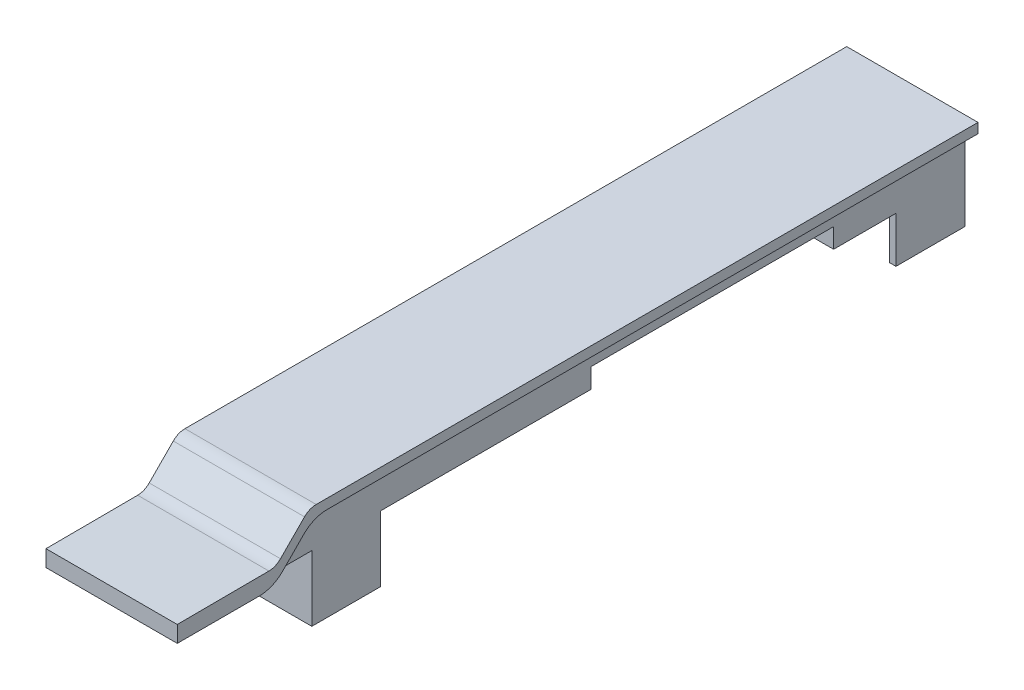
ISO-10303-21;
HEADER;
FILE_DESCRIPTION(('STEP AP214'),'2;1');
FILE_NAME('part.step','',(''),(''),'','','');
FILE_SCHEMA(('AUTOMOTIVE_DESIGN { 1 0 10303 214 1 1 1 1 }'));
ENDSEC;
DATA;
#1=APPLICATION_CONTEXT('core data for automotive mechanical design processes');
#2=APPLICATION_PROTOCOL_DEFINITION('international standard','automotive_design',2000,#1);
#3=PRODUCT_CONTEXT('',#1,'mechanical');
#4=PRODUCT('Part','Part','',(#3));
#5=PRODUCT_RELATED_PRODUCT_CATEGORY('part','',(#4));
#6=PRODUCT_DEFINITION_FORMATION('','',#4);
#7=PRODUCT_DEFINITION_CONTEXT('part definition',#1,'design');
#8=PRODUCT_DEFINITION('design','',#6,#7);
#9=PRODUCT_DEFINITION_SHAPE('','',#8);
#10=(LENGTH_UNIT() NAMED_UNIT(*) SI_UNIT(.MILLI.,.METRE.));
#11=(NAMED_UNIT(*) PLANE_ANGLE_UNIT() SI_UNIT($,.RADIAN.));
#12=(NAMED_UNIT(*) SI_UNIT($,.STERADIAN.) SOLID_ANGLE_UNIT());
#13=UNCERTAINTY_MEASURE_WITH_UNIT(LENGTH_MEASURE(1.E-05),#10,'distance_accuracy_value','');
#14=(GEOMETRIC_REPRESENTATION_CONTEXT(3) GLOBAL_UNCERTAINTY_ASSIGNED_CONTEXT((#13)) GLOBAL_UNIT_ASSIGNED_CONTEXT((#10,
#11,#12)) REPRESENTATION_CONTEXT('',''));
#15=CARTESIAN_POINT('',(0.,0.,0.));
#16=DIRECTION('',(0.,0.,1.));
#17=DIRECTION('',(1.,0.,0.));
#18=AXIS2_PLACEMENT_3D('',#15,#16,#17);
#19=CARTESIAN_POINT('',(40.,0.,0.));
#20=DIRECTION('',(0.,1.,0.));
#21=DIRECTION('',(0.,0.,1.));
#22=AXIS2_PLACEMENT_3D('',#19,#20,#21);
#23=PLANE('',#22);
#24=DIRECTION('',(-1.,0.,0.));
#25=VECTOR('',#24,1.);
#26=CARTESIAN_POINT('',(36.,0.,85.));
#27=LINE('',#26,#25);
#28=CARTESIAN_POINT('',(36.,0.,85.));
#29=VERTEX_POINT('',#28);
#30=CARTESIAN_POINT('',(4.,0.,85.));
#31=VERTEX_POINT('',#30);
#32=EDGE_CURVE('E357',#29,#31,#27,.T.);
#33=ORIENTED_EDGE('',*,*,#32,.F.);
#34=DIRECTION('',(0.,0.,-1.));
#35=VECTOR('',#34,1.);
#36=CARTESIAN_POINT('',(36.,0.,100.876178748993));
#37=LINE('',#36,#35);
#38=CARTESIAN_POINT('',(36.,0.,105.047297751826));
#39=VERTEX_POINT('',#38);
#40=EDGE_CURVE('E426',#39,#29,#37,.T.);
#41=ORIENTED_EDGE('',*,*,#40,.F.);
#42=DIRECTION('',(1.,0.,0.));
#43=VECTOR('',#42,1.);
#44=CARTESIAN_POINT('',(40.,0.,105.047297751826));
#45=LINE('',#44,#43);
#46=CARTESIAN_POINT('',(40.,0.,105.047297751826));
#47=VERTEX_POINT('',#46);
#48=EDGE_CURVE('E505',#39,#47,#45,.T.);
#49=ORIENTED_EDGE('',*,*,#48,.T.);
#50=DIRECTION('',(0.,0.,-1.));
#51=VECTOR('',#50,1.);
#52=CARTESIAN_POINT('',(40.,0.,0.));
#53=LINE('',#52,#51);
#54=CARTESIAN_POINT('',(40.,0.,130.));
#55=VERTEX_POINT('',#54);
#56=EDGE_CURVE('E456',#55,#47,#53,.T.);
#57=ORIENTED_EDGE('',*,*,#56,.F.);
#58=DIRECTION('',(-1.,0.,0.));
#59=VECTOR('',#58,1.);
#60=CARTESIAN_POINT('',(40.,0.,130.));
#61=LINE('',#60,#59);
#62=CARTESIAN_POINT('',(0.,0.,130.));
#63=VERTEX_POINT('',#62);
#64=EDGE_CURVE('E475',#55,#63,#61,.T.);
#65=ORIENTED_EDGE('',*,*,#64,.T.);
#66=DIRECTION('',(0.,0.,-1.));
#67=VECTOR('',#66,1.);
#68=CARTESIAN_POINT('',(0.,0.,0.));
#69=LINE('',#68,#67);
#70=CARTESIAN_POINT('',(0.,0.,105.047297751826));
#71=VERTEX_POINT('',#70);
#72=EDGE_CURVE('E446',#63,#71,#69,.T.);
#73=ORIENTED_EDGE('',*,*,#72,.T.);
#74=DIRECTION('',(-1.,0.,0.));
#75=VECTOR('',#74,1.);
#76=CARTESIAN_POINT('',(4.,0.,105.047297751826));
#77=LINE('',#76,#75);
#78=CARTESIAN_POINT('',(4.,0.,105.047297751826));
#79=VERTEX_POINT('',#78);
#80=EDGE_CURVE('E508',#71,#79,#77,.F.);
#81=ORIENTED_EDGE('',*,*,#80,.T.);
#82=DIRECTION('',(0.,0.,-1.));
#83=VECTOR('',#82,1.);
#84=CARTESIAN_POINT('',(4.,0.,100.876178748993));
#85=LINE('',#84,#83);
#86=EDGE_CURVE('E391',#79,#31,#85,.T.);
#87=ORIENTED_EDGE('',*,*,#86,.T.);
#88=EDGE_LOOP('',(#33,#41,#49,#57,#65,#73,#81,#87));
#89=FACE_BOUND('',#88,.T.);
#90=ADVANCED_FACE('F39',(#89),#23,.F.);
#91=DIRECTION('',(1.,0.,0.));
#92=VECTOR('',#91,1.);
#93=CARTESIAN_POINT('',(36.,0.,64.));
#94=LINE('',#93,#92);
#95=CARTESIAN_POINT('',(34.,0.,64.));
#96=VERTEX_POINT('',#95);
#97=CARTESIAN_POINT('',(36.,0.,64.));
#98=VERTEX_POINT('',#97);
#99=EDGE_CURVE('E354',#96,#98,#94,.T.);
#100=ORIENTED_EDGE('',*,*,#99,.F.);
#101=DIRECTION('',(0.,0.,-1.));
#102=VECTOR('',#101,1.);
#103=CARTESIAN_POINT('',(34.,0.,64.));
#104=LINE('',#103,#102);
#105=CARTESIAN_POINT('',(34.,0.,83.));
#106=VERTEX_POINT('',#105);
#107=EDGE_CURVE('E351',#106,#96,#104,.T.);
#108=ORIENTED_EDGE('',*,*,#107,.F.);
#109=DIRECTION('',(1.,0.,0.));
#110=VECTOR('',#109,1.);
#111=CARTESIAN_POINT('',(6.,0.,83.));
#112=LINE('',#111,#110);
#113=CARTESIAN_POINT('',(6.,0.,83.));
#114=VERTEX_POINT('',#113);
#115=EDGE_CURVE('E348',#114,#106,#112,.T.);
#116=ORIENTED_EDGE('',*,*,#115,.F.);
#117=DIRECTION('',(0.,0.,1.));
#118=VECTOR('',#117,1.);
#119=CARTESIAN_POINT('',(6.,0.,64.));
#120=LINE('',#119,#118);
#121=CARTESIAN_POINT('',(6.,0.,64.));
#122=VERTEX_POINT('',#121);
#123=EDGE_CURVE('E316',#122,#114,#120,.T.);
#124=ORIENTED_EDGE('',*,*,#123,.F.);
#125=DIRECTION('',(1.,0.,0.));
#126=VECTOR('',#125,1.);
#127=CARTESIAN_POINT('',(4.,0.,64.));
#128=LINE('',#127,#126);
#129=CARTESIAN_POINT('',(4.,0.,64.));
#130=VERTEX_POINT('',#129);
#131=EDGE_CURVE('E331',#130,#122,#128,.T.);
#132=ORIENTED_EDGE('',*,*,#131,.F.);
#133=CARTESIAN_POINT('',(4.,0.,0.));
#134=VERTEX_POINT('',#133);
#135=EDGE_CURVE('E394',#130,#134,#85,.T.);
#136=ORIENTED_EDGE('',*,*,#135,.T.);
#137=DIRECTION('',(-1.,0.,0.));
#138=VECTOR('',#137,1.);
#139=CARTESIAN_POINT('',(40.,0.,0.));
#140=LINE('',#139,#138);
#141=CARTESIAN_POINT('',(36.,0.,0.));
#142=VERTEX_POINT('',#141);
#143=EDGE_CURVE('E459',#142,#134,#140,.T.);
#144=ORIENTED_EDGE('',*,*,#143,.F.);
#145=EDGE_CURVE('E430',#98,#142,#37,.T.);
#146=ORIENTED_EDGE('',*,*,#145,.F.);
#147=EDGE_LOOP('',(#100,#108,#116,#124,#132,#136,#144,#146));
#148=FACE_BOUND('',#147,.T.);
#149=ADVANCED_FACE('F614',(#148),#23,.F.);
#150=CARTESIAN_POINT('',(40.,0.,0.));
#151=DIRECTION('',(0.,0.,1.));
#152=DIRECTION('',(1.,0.,0.));
#153=AXIS2_PLACEMENT_3D('',#150,#151,#152);
#154=PLANE('',#153);
#155=DIRECTION('',(0.,-1.,0.));
#156=VECTOR('',#155,1.);
#157=CARTESIAN_POINT('',(4.,0.,0.));
#158=LINE('',#157,#156);
#159=CARTESIAN_POINT('',(4.,6.,0.));
#160=VERTEX_POINT('',#159);
#161=EDGE_CURVE('E411',#160,#134,#158,.T.);
#162=ORIENTED_EDGE('',*,*,#161,.F.);
#163=DIRECTION('',(-1.,0.,0.));
#164=VECTOR('',#163,1.);
#165=CARTESIAN_POINT('',(40.,6.,0.));
#166=LINE('',#165,#164);
#167=CARTESIAN_POINT('',(36.,6.,0.));
#168=VERTEX_POINT('',#167);
#169=EDGE_CURVE('E490',#168,#160,#166,.T.);
#170=ORIENTED_EDGE('',*,*,#169,.F.);
#171=DIRECTION('',(0.,1.,0.));
#172=VECTOR('',#171,1.);
#173=CARTESIAN_POINT('',(36.,0.,0.));
#174=LINE('',#173,#172);
#175=EDGE_CURVE('E440',#142,#168,#174,.T.);
#176=ORIENTED_EDGE('',*,*,#175,.F.);
#177=ORIENTED_EDGE('',*,*,#143,.T.);
#178=EDGE_LOOP('',(#162,#170,#176,#177));
#179=FACE_BOUND('',#178,.T.);
#180=ADVANCED_FACE('F620',(#179),#154,.F.);
#181=CARTESIAN_POINT('',(40.,6.,0.));
#182=DIRECTION('',(0.,1.,0.));
#183=DIRECTION('',(0.,0.,1.));
#184=AXIS2_PLACEMENT_3D('',#181,#182,#183);
#185=PLANE('',#184);
#186=DIRECTION('',(0.,0.,1.));
#187=VECTOR('',#186,1.);
#188=CARTESIAN_POINT('',(4.,6.,0.));
#189=LINE('',#188,#187);
#190=CARTESIAN_POINT('',(4.,6.,-74.));
#191=VERTEX_POINT('',#190);
#192=EDGE_CURVE('E409',#191,#160,#189,.T.);
#193=ORIENTED_EDGE('',*,*,#192,.F.);
#194=DIRECTION('',(-1.,0.,0.));
#195=VECTOR('',#194,1.);
#196=CARTESIAN_POINT('',(40.,6.,-74.));
#197=LINE('',#196,#195);
#198=CARTESIAN_POINT('',(36.,6.,-74.));
#199=VERTEX_POINT('',#198);
#200=EDGE_CURVE('E487',#199,#191,#197,.T.);
#201=ORIENTED_EDGE('',*,*,#200,.F.);
#202=DIRECTION('',(0.,0.,-1.));
#203=VECTOR('',#202,1.);
#204=CARTESIAN_POINT('',(36.,6.,0.));
#205=LINE('',#204,#203);
#206=EDGE_CURVE('E438',#168,#199,#205,.T.);
#207=ORIENTED_EDGE('',*,*,#206,.F.);
#208=ORIENTED_EDGE('',*,*,#169,.T.);
#209=EDGE_LOOP('',(#193,#201,#207,#208));
#210=FACE_BOUND('',#209,.T.);
#211=ADVANCED_FACE('F921',(#210),#185,.F.);
#212=CARTESIAN_POINT('',(40.,6.,-74.));
#213=DIRECTION('',(0.,0.,-1.));
#214=DIRECTION('',(-1.,0.,0.));
#215=AXIS2_PLACEMENT_3D('',#212,#213,#214);
#216=PLANE('',#215);
#217=DIRECTION('',(0.,1.,0.));
#218=VECTOR('',#217,1.);
#219=CARTESIAN_POINT('',(4.,6.,-74.));
#220=LINE('',#219,#218);
#221=CARTESIAN_POINT('',(4.,0.,-74.));
#222=VERTEX_POINT('',#221);
#223=EDGE_CURVE('E407',#222,#191,#220,.T.);
#224=ORIENTED_EDGE('',*,*,#223,.F.);
#225=DIRECTION('',(-1.,0.,0.));
#226=VECTOR('',#225,1.);
#227=CARTESIAN_POINT('',(40.,0.,-74.));
#228=LINE('',#227,#226);
#229=CARTESIAN_POINT('',(36.,0.,-74.));
#230=VERTEX_POINT('',#229);
#231=EDGE_CURVE('E484',#230,#222,#228,.T.);
#232=ORIENTED_EDGE('',*,*,#231,.F.);
#233=DIRECTION('',(0.,-1.,0.));
#234=VECTOR('',#233,1.);
#235=CARTESIAN_POINT('',(36.,6.,-74.));
#236=LINE('',#235,#234);
#237=EDGE_CURVE('E436',#199,#230,#236,.T.);
#238=ORIENTED_EDGE('',*,*,#237,.F.);
#239=ORIENTED_EDGE('',*,*,#200,.T.);
#240=EDGE_LOOP('',(#224,#232,#238,#239));
#241=FACE_BOUND('',#240,.T.);
#242=ADVANCED_FACE('F929',(#241),#216,.F.);
#243=CARTESIAN_POINT('',(40.,0.,-74.));
#244=DIRECTION('',(0.,1.,0.));
#245=DIRECTION('',(0.,0.,1.));
#246=AXIS2_PLACEMENT_3D('',#243,#244,#245);
#247=PLANE('',#246);
#248=CARTESIAN_POINT('',(4.,0.,-93.));
#249=VERTEX_POINT('',#248);
#250=EDGE_CURVE('E389',#222,#249,#85,.T.);
#251=ORIENTED_EDGE('',*,*,#250,.T.);
#252=DIRECTION('',(1.,0.,0.));
#253=VECTOR('',#252,1.);
#254=CARTESIAN_POINT('',(4.,0.,-93.));
#255=LINE('',#254,#253);
#256=CARTESIAN_POINT('',(5.99999999999999,0.,-93.));
#257=VERTEX_POINT('',#256);
#258=EDGE_CURVE('E310',#249,#257,#255,.T.);
#259=ORIENTED_EDGE('',*,*,#258,.T.);
#260=DIRECTION('',(0.,0.,-1.));
#261=VECTOR('',#260,1.);
#262=CARTESIAN_POINT('',(6.,0.,-93.));
#263=LINE('',#262,#261);
#264=CARTESIAN_POINT('',(5.99999999999999,0.,-112.));
#265=VERTEX_POINT('',#264);
#266=EDGE_CURVE('E275',#257,#265,#263,.T.);
#267=ORIENTED_EDGE('',*,*,#266,.T.);
#268=DIRECTION('',(-1.,0.,0.));
#269=VECTOR('',#268,1.);
#270=CARTESIAN_POINT('',(34.,0.,-112.));
#271=LINE('',#270,#269);
#272=CARTESIAN_POINT('',(34.,0.,-112.));
#273=VERTEX_POINT('',#272);
#274=EDGE_CURVE('E59',#273,#265,#271,.T.);
#275=ORIENTED_EDGE('',*,*,#274,.F.);
#276=DIRECTION('',(0.,0.,-1.));
#277=VECTOR('',#276,1.);
#278=CARTESIAN_POINT('',(34.,0.,-93.));
#279=LINE('',#278,#277);
#280=CARTESIAN_POINT('',(34.,0.,-93.));
#281=VERTEX_POINT('',#280);
#282=EDGE_CURVE('E54',#281,#273,#279,.T.);
#283=ORIENTED_EDGE('',*,*,#282,.F.);
#284=DIRECTION('',(-1.,0.,0.));
#285=VECTOR('',#284,1.);
#286=CARTESIAN_POINT('',(36.,0.,-93.));
#287=LINE('',#286,#285);
#288=CARTESIAN_POINT('',(36.,0.,-93.));
#289=VERTEX_POINT('',#288);
#290=EDGE_CURVE('E295',#289,#281,#287,.T.);
#291=ORIENTED_EDGE('',*,*,#290,.F.);
#292=EDGE_CURVE('E425',#230,#289,#37,.T.);
#293=ORIENTED_EDGE('',*,*,#292,.F.);
#294=ORIENTED_EDGE('',*,*,#231,.T.);
#295=EDGE_LOOP('',(#251,#259,#267,#275,#283,#291,#293,#294));
#296=FACE_BOUND('',#295,.T.);
#297=ADVANCED_FACE('F772',(#296),#247,.F.);
#298=CARTESIAN_POINT('',(40.,0.,-114.));
#299=DIRECTION('',(0.,0.,1.));
#300=DIRECTION('',(1.,0.,0.));
#301=AXIS2_PLACEMENT_3D('',#298,#299,#300);
#302=PLANE('',#301);
#303=DIRECTION('',(-1.,0.,0.));
#304=VECTOR('',#303,1.);
#305=CARTESIAN_POINT('',(4.,12.5,-114.));
#306=LINE('',#305,#304);
#307=CARTESIAN_POINT('',(4.,12.5,-114.));
#308=VERTEX_POINT('',#307);
#309=CARTESIAN_POINT('',(0.,12.5,-114.));
#310=VERTEX_POINT('',#309);
#311=EDGE_CURVE('E400',#308,#310,#306,.T.);
#312=ORIENTED_EDGE('',*,*,#311,.T.);
#313=DIRECTION('',(0.,1.,0.));
#314=VECTOR('',#313,1.);
#315=CARTESIAN_POINT('',(0.,0.,-114.));
#316=LINE('',#315,#314);
#317=CARTESIAN_POINT('',(0.,15.5,-114.));
#318=VERTEX_POINT('',#317);
#319=EDGE_CURVE('E442',#310,#318,#316,.T.);
#320=ORIENTED_EDGE('',*,*,#319,.T.);
#321=DIRECTION('',(-1.,0.,0.));
#322=VECTOR('',#321,1.);
#323=CARTESIAN_POINT('',(40.,15.5,-114.));
#324=LINE('',#323,#322);
#325=CARTESIAN_POINT('',(40.,15.5,-114.));
#326=VERTEX_POINT('',#325);
#327=EDGE_CURVE('E481',#326,#318,#324,.T.);
#328=ORIENTED_EDGE('',*,*,#327,.F.);
#329=DIRECTION('',(0.,1.,0.));
#330=VECTOR('',#329,1.);
#331=CARTESIAN_POINT('',(40.,0.,-114.));
#332=LINE('',#331,#330);
#333=CARTESIAN_POINT('',(40.,12.5,-114.));
#334=VERTEX_POINT('',#333);
#335=EDGE_CURVE('E443',#334,#326,#332,.T.);
#336=ORIENTED_EDGE('',*,*,#335,.F.);
#337=DIRECTION('',(1.,0.,0.));
#338=VECTOR('',#337,1.);
#339=CARTESIAN_POINT('',(36.,12.5,-114.));
#340=LINE('',#339,#338);
#341=CARTESIAN_POINT('',(36.,12.5,-114.));
#342=VERTEX_POINT('',#341);
#343=EDGE_CURVE('E429',#342,#334,#340,.T.);
#344=ORIENTED_EDGE('',*,*,#343,.F.);
#345=DIRECTION('',(0.,1.,0.));
#346=VECTOR('',#345,1.);
#347=CARTESIAN_POINT('',(36.,0.,-114.));
#348=LINE('',#347,#346);
#349=CARTESIAN_POINT('',(36.,-14.,-114.));
#350=VERTEX_POINT('',#349);
#351=EDGE_CURVE('E415',#350,#342,#348,.T.);
#352=ORIENTED_EDGE('',*,*,#351,.F.);
#353=DIRECTION('',(1.,0.,0.));
#354=VECTOR('',#353,1.);
#355=CARTESIAN_POINT('',(4.,-14.,-114.));
#356=LINE('',#355,#354);
#357=CARTESIAN_POINT('',(4.,-14.,-114.));
#358=VERTEX_POINT('',#357);
#359=EDGE_CURVE('E306',#358,#350,#356,.T.);
#360=ORIENTED_EDGE('',*,*,#359,.F.);
#361=DIRECTION('',(0.,1.,0.));
#362=VECTOR('',#361,1.);
#363=CARTESIAN_POINT('',(4.,0.,-114.));
#364=LINE('',#363,#362);
#365=EDGE_CURVE('E386',#358,#308,#364,.T.);
#366=ORIENTED_EDGE('',*,*,#365,.T.);
#367=EDGE_LOOP('',(#312,#320,#328,#336,#344,#352,#360,#366));
#368=FACE_BOUND('',#367,.T.);
#369=ADVANCED_FACE('F592',(#368),#302,.F.);
#370=CARTESIAN_POINT('',(0.,0.,0.));
#371=DIRECTION('',(-1.,0.,0.));
#372=DIRECTION('',(0.,0.,1.));
#373=AXIS2_PLACEMENT_3D('',#370,#371,#372);
#374=PLANE('',#373);
#375=DIRECTION('',(0.,-0.710593144394259,0.703603143213473));
#376=VECTOR('',#375,1.);
#377=CARTESIAN_POINT('',(0.,5.148280317063,100.000366453112));
#378=LINE('',#377,#376);
#379=CARTESIAN_POINT('',(0.,14.0180157160673,91.217881348318));
#380=VERTEX_POINT('',#379);
#381=CARTESIAN_POINT('',(0.,6.61996690575023,98.5431566308751));
#382=VERTEX_POINT('',#381);
#383=EDGE_CURVE('E464',#380,#382,#378,.T.);
#384=ORIENTED_EDGE('',*,*,#383,.F.);
#385=CARTESIAN_POINT('',(0.,10.5,87.6649156263467));
#386=DIRECTION('',(-1.,0.,0.));
#387=DIRECTION('',(0.,0.,1.));
#388=AXIS2_PLACEMENT_3D('',#385,#386,#387);
#389=CIRCLE('',#388,5.);
#390=CARTESIAN_POINT('',(0.,15.5,87.6649156263467));
#391=VERTEX_POINT('',#390);
#392=EDGE_CURVE('E536',#380,#391,#389,.T.);
#393=ORIENTED_EDGE('',*,*,#392,.T.);
#394=DIRECTION('',(0.,0.,1.));
#395=VECTOR('',#394,1.);
#396=CARTESIAN_POINT('',(0.,15.5,-114.));
#397=LINE('',#396,#395);
#398=EDGE_CURVE('E461',#318,#391,#397,.T.);
#399=ORIENTED_EDGE('',*,*,#398,.F.);
#400=ORIENTED_EDGE('',*,*,#319,.F.);
#401=DIRECTION('',(0.,0.,1.));
#402=VECTOR('',#401,1.);
#403=CARTESIAN_POINT('',(0.,12.5,-114.));
#404=LINE('',#403,#402);
#405=CARTESIAN_POINT('',(0.,12.5,84.3280204240809));
#406=VERTEX_POINT('',#405);
#407=EDGE_CURVE('E390',#310,#406,#404,.T.);
#408=ORIENTED_EDGE('',*,*,#407,.T.);
#409=CARTESIAN_POINT('',(0.,2.49999999999998,84.3280204240809));
#410=DIRECTION('',(-1.,0.,0.));
#411=DIRECTION('',(0.,0.,1.));
#412=AXIS2_PLACEMENT_3D('',#409,#410,#411);
#413=CIRCLE('',#412,10.);
#414=CARTESIAN_POINT('',(0.,9.53603143213471,91.4339518680234));
#415=VERTEX_POINT('',#414);
#416=EDGE_CURVE('E522',#406,#415,#413,.F.);
#417=ORIENTED_EDGE('',*,*,#416,.T.);
#418=DIRECTION('',(0.,-0.710593144394259,0.703603143213474));
#419=VECTOR('',#418,1.);
#420=CARTESIAN_POINT('',(0.,12.5,88.4991394269132));
#421=LINE('',#420,#419);
#422=CARTESIAN_POINT('',(0.,2.96396856786525,97.9413663078832));
#423=VERTEX_POINT('',#422);
#424=EDGE_CURVE('E385',#415,#423,#421,.T.);
#425=ORIENTED_EDGE('',*,*,#424,.T.);
#426=CARTESIAN_POINT('',(0.,9.99999999999999,105.047297751826));
#427=DIRECTION('',(-1.,0.,0.));
#428=DIRECTION('',(0.,0.,1.));
#429=AXIS2_PLACEMENT_3D('',#426,#427,#428);
#430=CIRCLE('',#429,10.);
#431=EDGE_CURVE('E503',#423,#71,#430,.T.);
#432=ORIENTED_EDGE('',*,*,#431,.T.);
#433=ORIENTED_EDGE('',*,*,#72,.F.);
#434=DIRECTION('',(0.,-1.,0.));
#435=VECTOR('',#434,1.);
#436=CARTESIAN_POINT('',(0.,0.,130.));
#437=LINE('',#436,#435);
#438=CARTESIAN_POINT('',(0.,4.99999999999998,130.));
#439=VERTEX_POINT('',#438);
#440=EDGE_CURVE('E469',#439,#63,#437,.T.);
#441=ORIENTED_EDGE('',*,*,#440,.F.);
#442=DIRECTION('',(0.,-0.00494267723543379,0.999987784896269));
#443=VECTOR('',#442,1.);
#444=CARTESIAN_POINT('',(0.,4.99999999999998,130.));
#445=LINE('',#444,#443);
#446=CARTESIAN_POINT('',(0.,5.13804369733625,102.071408966669));
#447=VERTEX_POINT('',#446);
#448=EDGE_CURVE('E467',#447,#439,#445,.T.);
#449=ORIENTED_EDGE('',*,*,#448,.F.);
#450=CARTESIAN_POINT('',(0.,10.1379826218176,102.096122352846));
#451=DIRECTION('',(-1.,0.,0.));
#452=DIRECTION('',(0.,0.,1.));
#453=AXIS2_PLACEMENT_3D('',#450,#451,#452);
#454=CIRCLE('',#453,5.);
#455=EDGE_CURVE('E47',#447,#382,#454,.F.);
#456=ORIENTED_EDGE('',*,*,#455,.T.);
#457=EDGE_LOOP('',(#384,#393,#399,#400,#408,#417,#425,#432,#433,#441,#449,#456));
#458=FACE_BOUND('',#457,.T.);
#459=ADVANCED_FACE('F547',(#458),#374,.T.);
#460=CARTESIAN_POINT('',(40.,15.5,-114.));
#461=DIRECTION('',(0.,-1.,0.));
#462=DIRECTION('',(0.,0.,-1.));
#463=AXIS2_PLACEMENT_3D('',#460,#461,#462);
#464=PLANE('',#463);
#465=ORIENTED_EDGE('',*,*,#398,.T.);
#466=DIRECTION('',(-1.,0.,0.));
#467=VECTOR('',#466,1.);
#468=CARTESIAN_POINT('',(40.,15.5,87.6649156263467));
#469=LINE('',#468,#467);
#470=CARTESIAN_POINT('',(40.,15.5,87.6649156263467));
#471=VERTEX_POINT('',#470);
#472=EDGE_CURVE('E538',#391,#471,#469,.F.);
#473=ORIENTED_EDGE('',*,*,#472,.T.);
#474=DIRECTION('',(0.,0.,1.));
#475=VECTOR('',#474,1.);
#476=CARTESIAN_POINT('',(40.,15.5,-114.));
#477=LINE('',#476,#475);
#478=EDGE_CURVE('E445',#326,#471,#477,.T.);
#479=ORIENTED_EDGE('',*,*,#478,.F.);
#480=ORIENTED_EDGE('',*,*,#327,.T.);
#481=EDGE_LOOP('',(#465,#473,#479,#480));
#482=FACE_BOUND('',#481,.T.);
#483=ADVANCED_FACE('F603',(#482),#464,.F.);
#484=CARTESIAN_POINT('',(40.,5.148280317063,100.000366453112));
#485=DIRECTION('',(0.,-0.703603143213473,-0.710593144394259));
#486=DIRECTION('',(0.,0.710593144394259,-0.703603143213473));
#487=AXIS2_PLACEMENT_3D('',#484,#485,#486);
#488=PLANE('',#487);
#489=DIRECTION('',(0.,-0.710593144394259,0.703603143213473));
#490=VECTOR('',#489,1.);
#491=CARTESIAN_POINT('',(40.,5.148280317063,100.000366453112));
#492=LINE('',#491,#490);
#493=CARTESIAN_POINT('',(40.,14.0180157160673,91.217881348318));
#494=VERTEX_POINT('',#493);
#495=CARTESIAN_POINT('',(40.,6.61996690575023,98.5431566308751));
#496=VERTEX_POINT('',#495);
#497=EDGE_CURVE('E449',#494,#496,#492,.T.);
#498=ORIENTED_EDGE('',*,*,#497,.F.);
#499=DIRECTION('',(-1.,0.,0.));
#500=VECTOR('',#499,1.);
#501=CARTESIAN_POINT('',(40.,14.0180157160673,91.217881348318));
#502=LINE('',#501,#500);
#503=EDGE_CURVE('E533',#494,#380,#502,.T.);
#504=ORIENTED_EDGE('',*,*,#503,.T.);
#505=ORIENTED_EDGE('',*,*,#383,.T.);
#506=DIRECTION('',(-1.,0.,0.));
#507=VECTOR('',#506,1.);
#508=CARTESIAN_POINT('',(40.,6.61996690575023,98.5431566308751));
#509=LINE('',#508,#507);
#510=EDGE_CURVE('E531',#382,#496,#509,.F.);
#511=ORIENTED_EDGE('',*,*,#510,.T.);
#512=EDGE_LOOP('',(#498,#504,#505,#511));
#513=FACE_BOUND('',#512,.T.);
#514=ADVANCED_FACE('F554',(#513),#488,.F.);
#515=CARTESIAN_POINT('',(40.,4.99999999999998,130.));
#516=DIRECTION('',(0.,-0.999987784896269,-0.00494267723543379));
#517=DIRECTION('',(0.,0.00494267723543379,-0.999987784896269));
#518=AXIS2_PLACEMENT_3D('',#515,#516,#517);
#519=PLANE('',#518);
#520=DIRECTION('',(0.,-0.00494267723543379,0.999987784896269));
#521=VECTOR('',#520,1.);
#522=CARTESIAN_POINT('',(40.,4.99999999999998,130.));
#523=LINE('',#522,#521);
#524=CARTESIAN_POINT('',(40.,5.13804369733625,102.071408966669));
#525=VERTEX_POINT('',#524);
#526=CARTESIAN_POINT('',(40.,4.99999999999998,130.));
#527=VERTEX_POINT('',#526);
#528=EDGE_CURVE('E452',#525,#527,#523,.T.);
#529=ORIENTED_EDGE('',*,*,#528,.F.);
#530=DIRECTION('',(-1.,0.,0.));
#531=VECTOR('',#530,1.);
#532=CARTESIAN_POINT('',(0.,5.13804369733625,102.071408966669));
#533=LINE('',#532,#531);
#534=EDGE_CURVE('E542',#525,#447,#533,.T.);
#535=ORIENTED_EDGE('',*,*,#534,.T.);
#536=ORIENTED_EDGE('',*,*,#448,.T.);
#537=DIRECTION('',(-1.,0.,0.));
#538=VECTOR('',#537,1.);
#539=CARTESIAN_POINT('',(40.,4.99999999999998,130.));
#540=LINE('',#539,#538);
#541=EDGE_CURVE('E478',#527,#439,#540,.T.);
#542=ORIENTED_EDGE('',*,*,#541,.F.);
#543=EDGE_LOOP('',(#529,#535,#536,#542));
#544=FACE_BOUND('',#543,.T.);
#545=ADVANCED_FACE('F562',(#544),#519,.F.);
#546=CARTESIAN_POINT('',(40.,0.,130.));
#547=DIRECTION('',(0.,0.,-1.));
#548=DIRECTION('',(-1.,0.,0.));
#549=AXIS2_PLACEMENT_3D('',#546,#547,#548);
#550=PLANE('',#549);
#551=ORIENTED_EDGE('',*,*,#440,.T.);
#552=ORIENTED_EDGE('',*,*,#64,.F.);
#553=DIRECTION('',(0.,-1.,0.));
#554=VECTOR('',#553,1.);
#555=CARTESIAN_POINT('',(40.,0.,130.));
#556=LINE('',#555,#554);
#557=EDGE_CURVE('E454',#527,#55,#556,.T.);
#558=ORIENTED_EDGE('',*,*,#557,.F.);
#559=ORIENTED_EDGE('',*,*,#541,.T.);
#560=EDGE_LOOP('',(#551,#552,#558,#559));
#561=FACE_BOUND('',#560,.T.);
#562=ADVANCED_FACE('F566',(#561),#550,.F.);
#563=CARTESIAN_POINT('',(40.,0.,0.));
#564=DIRECTION('',(-1.,0.,0.));
#565=DIRECTION('',(0.,0.,1.));
#566=AXIS2_PLACEMENT_3D('',#563,#564,#565);
#567=PLANE('',#566);
#568=ORIENTED_EDGE('',*,*,#478,.T.);
#569=CARTESIAN_POINT('',(40.,10.5,87.6649156263467));
#570=DIRECTION('',(-1.,0.,0.));
#571=DIRECTION('',(0.,0.,1.));
#572=AXIS2_PLACEMENT_3D('',#569,#570,#571);
#573=CIRCLE('',#572,5.);
#574=EDGE_CURVE('E540',#471,#494,#573,.F.);
#575=ORIENTED_EDGE('',*,*,#574,.T.);
#576=ORIENTED_EDGE('',*,*,#497,.T.);
#577=CARTESIAN_POINT('',(40.,10.1379826218176,102.096122352846));
#578=DIRECTION('',(-1.,0.,0.));
#579=DIRECTION('',(0.,0.,1.));
#580=AXIS2_PLACEMENT_3D('',#577,#578,#579);
#581=CIRCLE('',#580,5.);
#582=EDGE_CURVE('E11',#496,#525,#581,.T.);
#583=ORIENTED_EDGE('',*,*,#582,.T.);
#584=ORIENTED_EDGE('',*,*,#528,.T.);
#585=ORIENTED_EDGE('',*,*,#557,.T.);
#586=ORIENTED_EDGE('',*,*,#56,.T.);
#587=CARTESIAN_POINT('',(40.,9.99999999999999,105.047297751826));
#588=DIRECTION('',(-1.,0.,0.));
#589=DIRECTION('',(0.,0.,1.));
#590=AXIS2_PLACEMENT_3D('',#587,#588,#589);
#591=CIRCLE('',#590,10.);
#592=CARTESIAN_POINT('',(40.,2.96396856786525,97.9413663078832));
#593=VERTEX_POINT('',#592);
#594=EDGE_CURVE('E511',#47,#593,#591,.F.);
#595=ORIENTED_EDGE('',*,*,#594,.T.);
#596=DIRECTION('',(0.,-0.710593144394259,0.703603143213474));
#597=VECTOR('',#596,1.);
#598=CARTESIAN_POINT('',(40.,12.5,88.4991394269132));
#599=LINE('',#598,#597);
#600=CARTESIAN_POINT('',(40.,9.53603143213471,91.4339518680234));
#601=VERTEX_POINT('',#600);
#602=EDGE_CURVE('E419',#601,#593,#599,.T.);
#603=ORIENTED_EDGE('',*,*,#602,.F.);
#604=CARTESIAN_POINT('',(40.,2.49999999999998,84.3280204240809));
#605=DIRECTION('',(-1.,0.,0.));
#606=DIRECTION('',(0.,0.,1.));
#607=AXIS2_PLACEMENT_3D('',#604,#605,#606);
#608=CIRCLE('',#607,10.);
#609=CARTESIAN_POINT('',(40.,12.5,84.3280204240809));
#610=VERTEX_POINT('',#609);
#611=EDGE_CURVE('E529',#601,#610,#608,.T.);
#612=ORIENTED_EDGE('',*,*,#611,.T.);
#613=DIRECTION('',(0.,0.,1.));
#614=VECTOR('',#613,1.);
#615=CARTESIAN_POINT('',(40.,12.5,-114.));
#616=LINE('',#615,#614);
#617=EDGE_CURVE('E414',#334,#610,#616,.T.);
#618=ORIENTED_EDGE('',*,*,#617,.F.);
#619=ORIENTED_EDGE('',*,*,#335,.T.);
#620=EDGE_LOOP('',(#568,#575,#576,#583,#584,#585,#586,#595,#603,#612,#618,#619));
#621=FACE_BOUND('',#620,.T.);
#622=ADVANCED_FACE('F559',(#621),#567,.F.);
#623=CARTESIAN_POINT('',(36.,0.,0.));
#624=DIRECTION('',(1.,0.,0.));
#625=DIRECTION('',(0.,0.,-1.));
#626=AXIS2_PLACEMENT_3D('',#623,#624,#625);
#627=PLANE('',#626);
#628=DIRECTION('',(0.,0.,1.));
#629=VECTOR('',#628,1.);
#630=CARTESIAN_POINT('',(36.,12.5,-114.));
#631=LINE('',#630,#629);
#632=CARTESIAN_POINT('',(36.,12.5,84.3280204240809));
#633=VERTEX_POINT('',#632);
#634=EDGE_CURVE('E418',#342,#633,#631,.T.);
#635=ORIENTED_EDGE('',*,*,#634,.T.);
#636=CARTESIAN_POINT('',(36.,2.49999999999998,84.3280204240809));
#637=DIRECTION('',(1.,0.,0.));
#638=DIRECTION('',(0.,0.,-1.));
#639=AXIS2_PLACEMENT_3D('',#636,#637,#638);
#640=CIRCLE('',#639,10.);
#641=CARTESIAN_POINT('',(36.,9.53603143213471,91.4339518680234));
#642=VERTEX_POINT('',#641);
#643=EDGE_CURVE('E520',#633,#642,#640,.T.);
#644=ORIENTED_EDGE('',*,*,#643,.T.);
#645=DIRECTION('',(0.,-0.710593144394259,0.703603143213474));
#646=VECTOR('',#645,1.);
#647=CARTESIAN_POINT('',(36.,12.5,88.4991394269132));
#648=LINE('',#647,#646);
#649=CARTESIAN_POINT('',(36.,2.96396856786525,97.9413663078832));
#650=VERTEX_POINT('',#649);
#651=EDGE_CURVE('E422',#642,#650,#648,.T.);
#652=ORIENTED_EDGE('',*,*,#651,.T.);
#653=CARTESIAN_POINT('',(36.,9.99999999999999,105.047297751826));
#654=DIRECTION('',(1.,0.,0.));
#655=DIRECTION('',(0.,0.,-1.));
#656=AXIS2_PLACEMENT_3D('',#653,#654,#655);
#657=CIRCLE('',#656,10.);
#658=EDGE_CURVE('E526',#650,#39,#657,.F.);
#659=ORIENTED_EDGE('',*,*,#658,.T.);
#660=ORIENTED_EDGE('',*,*,#40,.T.);
#661=DIRECTION('',(0.,1.,0.));
#662=VECTOR('',#661,1.);
#663=CARTESIAN_POINT('',(36.,-20.,85.));
#664=LINE('',#663,#662);
#665=CARTESIAN_POINT('',(36.,-20.,85.));
#666=VERTEX_POINT('',#665);
#667=EDGE_CURVE('E370',#666,#29,#664,.T.);
#668=ORIENTED_EDGE('',*,*,#667,.F.);
#669=DIRECTION('',(0.,0.,1.));
#670=VECTOR('',#669,1.);
#671=CARTESIAN_POINT('',(36.,-20.,85.));
#672=LINE('',#671,#670);
#673=CARTESIAN_POINT('',(36.,-20.,64.));
#674=VERTEX_POINT('',#673);
#675=EDGE_CURVE('E337',#674,#666,#672,.T.);
#676=ORIENTED_EDGE('',*,*,#675,.F.);
#677=DIRECTION('',(0.,1.,0.));
#678=VECTOR('',#677,1.);
#679=CARTESIAN_POINT('',(36.,-20.,64.));
#680=LINE('',#679,#678);
#681=EDGE_CURVE('E373',#674,#98,#680,.T.);
#682=ORIENTED_EDGE('',*,*,#681,.T.);
#683=ORIENTED_EDGE('',*,*,#145,.T.);
#684=ORIENTED_EDGE('',*,*,#175,.T.);
#685=ORIENTED_EDGE('',*,*,#206,.T.);
#686=ORIENTED_EDGE('',*,*,#237,.T.);
#687=ORIENTED_EDGE('',*,*,#292,.T.);
#688=DIRECTION('',(0.,1.,0.));
#689=VECTOR('',#688,1.);
#690=CARTESIAN_POINT('',(36.,-14.,-93.));
#691=LINE('',#690,#689);
#692=CARTESIAN_POINT('',(36.,-14.,-93.));
#693=VERTEX_POINT('',#692);
#694=EDGE_CURVE('E317',#693,#289,#691,.T.);
#695=ORIENTED_EDGE('',*,*,#694,.F.);
#696=DIRECTION('',(0.,0.,1.));
#697=VECTOR('',#696,1.);
#698=CARTESIAN_POINT('',(36.,-14.,-114.));
#699=LINE('',#698,#697);
#700=EDGE_CURVE('E304',#350,#693,#699,.T.);
#701=ORIENTED_EDGE('',*,*,#700,.F.);
#702=ORIENTED_EDGE('',*,*,#351,.T.);
#703=EDGE_LOOP('',(#635,#644,#652,#659,#660,#668,#676,#682,#683,#684,#685,#686,#687,#695,#701,#702));
#704=FACE_BOUND('',#703,.T.);
#705=ADVANCED_FACE('F581',(#704),#627,.T.);
#706=CARTESIAN_POINT('',(36.,12.5,88.4991394269132));
#707=DIRECTION('',(0.,0.703603143213473,0.710593144394259));
#708=DIRECTION('',(0.,-0.710593144394259,0.703603143213473));
#709=AXIS2_PLACEMENT_3D('',#706,#707,#708);
#710=PLANE('',#709);
#711=ORIENTED_EDGE('',*,*,#602,.T.);
#712=DIRECTION('',(1.,0.,0.));
#713=VECTOR('',#712,1.);
#714=CARTESIAN_POINT('',(36.,2.96396856786525,97.9413663078832));
#715=LINE('',#714,#713);
#716=EDGE_CURVE('E516',#593,#650,#715,.F.);
#717=ORIENTED_EDGE('',*,*,#716,.T.);
#718=ORIENTED_EDGE('',*,*,#651,.F.);
#719=DIRECTION('',(1.,0.,0.));
#720=VECTOR('',#719,1.);
#721=CARTESIAN_POINT('',(40.,9.53603143213471,91.4339518680234));
#722=LINE('',#721,#720);
#723=EDGE_CURVE('E513',#642,#601,#722,.T.);
#724=ORIENTED_EDGE('',*,*,#723,.T.);
#725=EDGE_LOOP('',(#711,#717,#718,#724));
#726=FACE_BOUND('',#725,.T.);
#727=ADVANCED_FACE('F578',(#726),#710,.F.);
#728=CARTESIAN_POINT('',(36.,12.5,-114.));
#729=DIRECTION('',(0.,1.,0.));
#730=DIRECTION('',(0.,0.,1.));
#731=AXIS2_PLACEMENT_3D('',#728,#729,#730);
#732=PLANE('',#731);
#733=ORIENTED_EDGE('',*,*,#617,.T.);
#734=DIRECTION('',(1.,0.,0.));
#735=VECTOR('',#734,1.);
#736=CARTESIAN_POINT('',(36.,12.5,84.3280204240809));
#737=LINE('',#736,#735);
#738=EDGE_CURVE('E518',#610,#633,#737,.F.);
#739=ORIENTED_EDGE('',*,*,#738,.T.);
#740=ORIENTED_EDGE('',*,*,#634,.F.);
#741=ORIENTED_EDGE('',*,*,#343,.T.);
#742=EDGE_LOOP('',(#733,#739,#740,#741));
#743=FACE_BOUND('',#742,.T.);
#744=ADVANCED_FACE('F589',(#743),#732,.F.);
#745=CARTESIAN_POINT('',(4.,0.,0.));
#746=DIRECTION('',(-1.,0.,0.));
#747=DIRECTION('',(0.,0.,-1.));
#748=AXIS2_PLACEMENT_3D('',#745,#746,#747);
#749=PLANE('',#748);
#750=DIRECTION('',(0.,-0.710593144394259,0.703603143213474));
#751=VECTOR('',#750,1.);
#752=CARTESIAN_POINT('',(4.,12.5,88.4991394269132));
#753=LINE('',#752,#751);
#754=CARTESIAN_POINT('',(4.,9.53603143213471,91.4339518680234));
#755=VERTEX_POINT('',#754);
#756=CARTESIAN_POINT('',(4.,2.96396856786525,97.9413663078832));
#757=VERTEX_POINT('',#756);
#758=EDGE_CURVE('E393',#755,#757,#753,.T.);
#759=ORIENTED_EDGE('',*,*,#758,.F.);
#760=CARTESIAN_POINT('',(4.,2.49999999999998,84.3280204240809));
#761=DIRECTION('',(-1.,0.,0.));
#762=DIRECTION('',(0.,0.,1.));
#763=AXIS2_PLACEMENT_3D('',#760,#761,#762);
#764=CIRCLE('',#763,10.);
#765=CARTESIAN_POINT('',(4.,12.5,84.3280204240809));
#766=VERTEX_POINT('',#765);
#767=EDGE_CURVE('E501',#755,#766,#764,.T.);
#768=ORIENTED_EDGE('',*,*,#767,.T.);
#769=DIRECTION('',(0.,0.,1.));
#770=VECTOR('',#769,1.);
#771=CARTESIAN_POINT('',(4.,12.5,-114.));
#772=LINE('',#771,#770);
#773=EDGE_CURVE('E397',#308,#766,#772,.T.);
#774=ORIENTED_EDGE('',*,*,#773,.F.);
#775=ORIENTED_EDGE('',*,*,#365,.F.);
#776=DIRECTION('',(0.,0.,1.));
#777=VECTOR('',#776,1.);
#778=CARTESIAN_POINT('',(4.,-14.,-114.));
#779=LINE('',#778,#777);
#780=CARTESIAN_POINT('',(4.,-14.,-93.));
#781=VERTEX_POINT('',#780);
#782=EDGE_CURVE('E280',#358,#781,#779,.T.);
#783=ORIENTED_EDGE('',*,*,#782,.T.);
#784=DIRECTION('',(0.,1.,0.));
#785=VECTOR('',#784,1.);
#786=CARTESIAN_POINT('',(4.,-14.,-93.));
#787=LINE('',#786,#785);
#788=EDGE_CURVE('E294',#781,#249,#787,.T.);
#789=ORIENTED_EDGE('',*,*,#788,.T.);
#790=ORIENTED_EDGE('',*,*,#250,.F.);
#791=ORIENTED_EDGE('',*,*,#223,.T.);
#792=ORIENTED_EDGE('',*,*,#192,.T.);
#793=ORIENTED_EDGE('',*,*,#161,.T.);
#794=ORIENTED_EDGE('',*,*,#135,.F.);
#795=DIRECTION('',(0.,1.,0.));
#796=VECTOR('',#795,1.);
#797=CARTESIAN_POINT('',(4.,-20.,64.));
#798=LINE('',#797,#796);
#799=CARTESIAN_POINT('',(4.,-20.,64.));
#800=VERTEX_POINT('',#799);
#801=EDGE_CURVE('E364',#800,#130,#798,.T.);
#802=ORIENTED_EDGE('',*,*,#801,.F.);
#803=DIRECTION('',(0.,0.,-1.));
#804=VECTOR('',#803,1.);
#805=CARTESIAN_POINT('',(4.,-20.,85.));
#806=LINE('',#805,#804);
#807=CARTESIAN_POINT('',(4.,-20.,85.));
#808=VERTEX_POINT('',#807);
#809=EDGE_CURVE('E341',#808,#800,#806,.T.);
#810=ORIENTED_EDGE('',*,*,#809,.F.);
#811=DIRECTION('',(0.,1.,0.));
#812=VECTOR('',#811,1.);
#813=CARTESIAN_POINT('',(4.,-20.,85.));
#814=LINE('',#813,#812);
#815=EDGE_CURVE('E367',#808,#31,#814,.T.);
#816=ORIENTED_EDGE('',*,*,#815,.T.);
#817=ORIENTED_EDGE('',*,*,#86,.F.);
#818=CARTESIAN_POINT('',(4.,9.99999999999999,105.047297751826));
#819=DIRECTION('',(-1.,0.,0.));
#820=DIRECTION('',(0.,0.,1.));
#821=AXIS2_PLACEMENT_3D('',#818,#819,#820);
#822=CIRCLE('',#821,10.);
#823=EDGE_CURVE('E524',#79,#757,#822,.F.);
#824=ORIENTED_EDGE('',*,*,#823,.T.);
#825=EDGE_LOOP('',(#759,#768,#774,#775,#783,#789,#790,#791,#792,#793,#794,#802,#810,#816,#817,#824));
#826=FACE_BOUND('',#825,.T.);
#827=ADVANCED_FACE('F683',(#826),#749,.T.);
#828=CARTESIAN_POINT('',(4.,12.5,-114.));
#829=DIRECTION('',(0.,-1.,0.));
#830=DIRECTION('',(0.,0.,-1.));
#831=AXIS2_PLACEMENT_3D('',#828,#829,#830);
#832=PLANE('',#831);
#833=ORIENTED_EDGE('',*,*,#773,.T.);
#834=DIRECTION('',(-1.,0.,0.));
#835=VECTOR('',#834,1.);
#836=CARTESIAN_POINT('',(0.,12.5,84.3280204240809));
#837=LINE('',#836,#835);
#838=EDGE_CURVE('E493',#766,#406,#837,.T.);
#839=ORIENTED_EDGE('',*,*,#838,.T.);
#840=ORIENTED_EDGE('',*,*,#407,.F.);
#841=ORIENTED_EDGE('',*,*,#311,.F.);
#842=EDGE_LOOP('',(#833,#839,#840,#841));
#843=FACE_BOUND('',#842,.T.);
#844=ADVANCED_FACE('F689',(#843),#832,.T.);
#845=CARTESIAN_POINT('',(4.,12.5,88.4991394269132));
#846=DIRECTION('',(0.,-0.703603143213473,-0.710593144394259));
#847=DIRECTION('',(0.,0.710593144394259,-0.703603143213473));
#848=AXIS2_PLACEMENT_3D('',#845,#846,#847);
#849=PLANE('',#848);
#850=ORIENTED_EDGE('',*,*,#424,.F.);
#851=DIRECTION('',(-1.,0.,0.));
#852=VECTOR('',#851,1.);
#853=CARTESIAN_POINT('',(4.,9.53603143213471,91.4339518680234));
#854=LINE('',#853,#852);
#855=EDGE_CURVE('E499',#415,#755,#854,.F.);
#856=ORIENTED_EDGE('',*,*,#855,.T.);
#857=ORIENTED_EDGE('',*,*,#758,.T.);
#858=DIRECTION('',(-1.,0.,0.));
#859=VECTOR('',#858,1.);
#860=CARTESIAN_POINT('',(0.,2.96396856786525,97.9413663078832));
#861=LINE('',#860,#859);
#862=EDGE_CURVE('E496',#757,#423,#861,.T.);
#863=ORIENTED_EDGE('',*,*,#862,.T.);
#864=EDGE_LOOP('',(#850,#856,#857,#863));
#865=FACE_BOUND('',#864,.T.);
#866=ADVANCED_FACE('F837',(#865),#849,.T.);
#867=CARTESIAN_POINT('',(4.,2.49999999999998,84.3280204240809));
#868=DIRECTION('',(1.,0.,0.));
#869=DIRECTION('',(0.,0.,-1.));
#870=AXIS2_PLACEMENT_3D('',#867,#868,#869);
#871=CYLINDRICAL_SURFACE('',#870,10.);
#872=ORIENTED_EDGE('',*,*,#767,.F.);
#873=ORIENTED_EDGE('',*,*,#855,.F.);
#874=ORIENTED_EDGE('',*,*,#416,.F.);
#875=ORIENTED_EDGE('',*,*,#838,.F.);
#876=EDGE_LOOP('',(#872,#873,#874,#875));
#877=FACE_BOUND('',#876,.T.);
#878=ADVANCED_FACE('F840',(#877),#871,.F.);
#879=CARTESIAN_POINT('',(4.,9.99999999999999,105.047297751826));
#880=DIRECTION('',(1.,0.,0.));
#881=DIRECTION('',(0.,0.,-1.));
#882=AXIS2_PLACEMENT_3D('',#879,#880,#881);
#883=CYLINDRICAL_SURFACE('',#882,10.);
#884=ORIENTED_EDGE('',*,*,#823,.F.);
#885=ORIENTED_EDGE('',*,*,#80,.F.);
#886=ORIENTED_EDGE('',*,*,#431,.F.);
#887=ORIENTED_EDGE('',*,*,#862,.F.);
#888=EDGE_LOOP('',(#884,#885,#886,#887));
#889=FACE_BOUND('',#888,.T.);
#890=ADVANCED_FACE('F867',(#889),#883,.T.);
#891=CARTESIAN_POINT('',(40.,9.99999999999999,105.047297751826));
#892=DIRECTION('',(1.,0.,0.));
#893=DIRECTION('',(0.,0.,-1.));
#894=AXIS2_PLACEMENT_3D('',#891,#892,#893);
#895=CYLINDRICAL_SURFACE('',#894,10.);
#896=ORIENTED_EDGE('',*,*,#658,.F.);
#897=ORIENTED_EDGE('',*,*,#716,.F.);
#898=ORIENTED_EDGE('',*,*,#594,.F.);
#899=ORIENTED_EDGE('',*,*,#48,.F.);
#900=EDGE_LOOP('',(#896,#897,#898,#899));
#901=FACE_BOUND('',#900,.T.);
#902=ADVANCED_FACE('F574',(#901),#895,.T.);
#903=CARTESIAN_POINT('',(36.,2.49999999999998,84.3280204240809));
#904=DIRECTION('',(-1.,0.,0.));
#905=DIRECTION('',(0.,0.,1.));
#906=AXIS2_PLACEMENT_3D('',#903,#904,#905);
#907=CYLINDRICAL_SURFACE('',#906,10.);
#908=ORIENTED_EDGE('',*,*,#643,.F.);
#909=ORIENTED_EDGE('',*,*,#738,.F.);
#910=ORIENTED_EDGE('',*,*,#611,.F.);
#911=ORIENTED_EDGE('',*,*,#723,.F.);
#912=EDGE_LOOP('',(#908,#909,#910,#911));
#913=FACE_BOUND('',#912,.T.);
#914=ADVANCED_FACE('F585',(#913),#907,.F.);
#915=CARTESIAN_POINT('',(40.,10.5,87.6649156263467));
#916=DIRECTION('',(-1.,0.,0.));
#917=DIRECTION('',(0.,0.,1.));
#918=AXIS2_PLACEMENT_3D('',#915,#916,#917);
#919=CYLINDRICAL_SURFACE('',#918,5.);
#920=ORIENTED_EDGE('',*,*,#574,.F.);
#921=ORIENTED_EDGE('',*,*,#472,.F.);
#922=ORIENTED_EDGE('',*,*,#392,.F.);
#923=ORIENTED_EDGE('',*,*,#503,.F.);
#924=EDGE_LOOP('',(#920,#921,#922,#923));
#925=FACE_BOUND('',#924,.T.);
#926=ADVANCED_FACE('F600',(#925),#919,.T.);
#927=CARTESIAN_POINT('',(40.,10.1379826218176,102.096122352846));
#928=DIRECTION('',(1.,0.,0.));
#929=DIRECTION('',(0.,0.,-1.));
#930=AXIS2_PLACEMENT_3D('',#927,#928,#929);
#931=CYLINDRICAL_SURFACE('',#930,5.);
#932=ORIENTED_EDGE('',*,*,#582,.F.);
#933=ORIENTED_EDGE('',*,*,#510,.F.);
#934=ORIENTED_EDGE('',*,*,#455,.F.);
#935=ORIENTED_EDGE('',*,*,#534,.F.);
#936=EDGE_LOOP('',(#932,#933,#934,#935));
#937=FACE_BOUND('',#936,.T.);
#938=ADVANCED_FACE('F41',(#937),#931,.F.);
#939=CARTESIAN_POINT('',(6.,-20.,64.));
#940=DIRECTION('',(-1.,0.,0.));
#941=DIRECTION('',(0.,0.,1.));
#942=AXIS2_PLACEMENT_3D('',#939,#940,#941);
#943=PLANE('',#942);
#944=ORIENTED_EDGE('',*,*,#123,.T.);
#945=DIRECTION('',(0.,1.,0.));
#946=VECTOR('',#945,1.);
#947=CARTESIAN_POINT('',(6.,-20.,83.));
#948=LINE('',#947,#946);
#949=CARTESIAN_POINT('',(6.,-20.,83.));
#950=VERTEX_POINT('',#949);
#951=EDGE_CURVE('E382',#950,#114,#948,.T.);
#952=ORIENTED_EDGE('',*,*,#951,.F.);
#953=DIRECTION('',(0.,0.,1.));
#954=VECTOR('',#953,1.);
#955=CARTESIAN_POINT('',(6.,-20.,64.));
#956=LINE('',#955,#954);
#957=CARTESIAN_POINT('',(6.,-20.,64.));
#958=VERTEX_POINT('',#957);
#959=EDGE_CURVE('E327',#958,#950,#956,.T.);
#960=ORIENTED_EDGE('',*,*,#959,.F.);
#961=DIRECTION('',(0.,1.,0.));
#962=VECTOR('',#961,1.);
#963=CARTESIAN_POINT('',(6.,-20.,64.));
#964=LINE('',#963,#962);
#965=EDGE_CURVE('E345',#958,#122,#964,.T.);
#966=ORIENTED_EDGE('',*,*,#965,.T.);
#967=EDGE_LOOP('',(#944,#952,#960,#966));
#968=FACE_BOUND('',#967,.T.);
#969=ADVANCED_FACE('F651',(#968),#943,.F.);
#970=CARTESIAN_POINT('',(6.,-20.,83.));
#971=DIRECTION('',(0.,0.,1.));
#972=DIRECTION('',(0.,-1.,0.));
#973=AXIS2_PLACEMENT_3D('',#970,#971,#972);
#974=PLANE('',#973);
#975=ORIENTED_EDGE('',*,*,#115,.T.);
#976=DIRECTION('',(0.,1.,0.));
#977=VECTOR('',#976,1.);
#978=CARTESIAN_POINT('',(34.,-20.,83.));
#979=LINE('',#978,#977);
#980=CARTESIAN_POINT('',(34.,-20.,83.));
#981=VERTEX_POINT('',#980);
#982=EDGE_CURVE('E379',#981,#106,#979,.T.);
#983=ORIENTED_EDGE('',*,*,#982,.F.);
#984=DIRECTION('',(1.,0.,0.));
#985=VECTOR('',#984,1.);
#986=CARTESIAN_POINT('',(6.,-20.,83.));
#987=LINE('',#986,#985);
#988=EDGE_CURVE('E330',#950,#981,#987,.T.);
#989=ORIENTED_EDGE('',*,*,#988,.F.);
#990=ORIENTED_EDGE('',*,*,#951,.T.);
#991=EDGE_LOOP('',(#975,#983,#989,#990));
#992=FACE_BOUND('',#991,.T.);
#993=ADVANCED_FACE('F703',(#992),#974,.F.);
#994=CARTESIAN_POINT('',(34.,-20.,64.));
#995=DIRECTION('',(1.,0.,0.));
#996=DIRECTION('',(0.,0.,-1.));
#997=AXIS2_PLACEMENT_3D('',#994,#995,#996);
#998=PLANE('',#997);
#999=ORIENTED_EDGE('',*,*,#107,.T.);
#1000=DIRECTION('',(0.,1.,0.));
#1001=VECTOR('',#1000,1.);
#1002=CARTESIAN_POINT('',(34.,-20.,64.));
#1003=LINE('',#1002,#1001);
#1004=CARTESIAN_POINT('',(34.,-20.,64.));
#1005=VERTEX_POINT('',#1004);
#1006=EDGE_CURVE('E376',#1005,#96,#1003,.T.);
#1007=ORIENTED_EDGE('',*,*,#1006,.F.);
#1008=DIRECTION('',(0.,0.,-1.));
#1009=VECTOR('',#1008,1.);
#1010=CARTESIAN_POINT('',(34.,-20.,64.));
#1011=LINE('',#1010,#1009);
#1012=EDGE_CURVE('E333',#981,#1005,#1011,.T.);
#1013=ORIENTED_EDGE('',*,*,#1012,.F.);
#1014=ORIENTED_EDGE('',*,*,#982,.T.);
#1015=EDGE_LOOP('',(#999,#1007,#1013,#1014));
#1016=FACE_BOUND('',#1015,.T.);
#1017=ADVANCED_FACE('F713',(#1016),#998,.F.);
#1018=CARTESIAN_POINT('',(36.,-20.,64.));
#1019=DIRECTION('',(0.,0.,1.));
#1020=DIRECTION('',(0.,-1.,0.));
#1021=AXIS2_PLACEMENT_3D('',#1018,#1019,#1020);
#1022=PLANE('',#1021);
#1023=ORIENTED_EDGE('',*,*,#99,.T.);
#1024=ORIENTED_EDGE('',*,*,#681,.F.);
#1025=DIRECTION('',(1.,0.,0.));
#1026=VECTOR('',#1025,1.);
#1027=CARTESIAN_POINT('',(36.,-20.,64.));
#1028=LINE('',#1027,#1026);
#1029=EDGE_CURVE('E335',#1005,#674,#1028,.T.);
#1030=ORIENTED_EDGE('',*,*,#1029,.F.);
#1031=ORIENTED_EDGE('',*,*,#1006,.T.);
#1032=EDGE_LOOP('',(#1023,#1024,#1030,#1031));
#1033=FACE_BOUND('',#1032,.T.);
#1034=ADVANCED_FACE('F723',(#1033),#1022,.F.);
#1035=CARTESIAN_POINT('',(36.,-20.,85.));
#1036=DIRECTION('',(0.,0.,-1.));
#1037=DIRECTION('',(0.,1.,0.));
#1038=AXIS2_PLACEMENT_3D('',#1035,#1036,#1037);
#1039=PLANE('',#1038);
#1040=ORIENTED_EDGE('',*,*,#32,.T.);
#1041=ORIENTED_EDGE('',*,*,#815,.F.);
#1042=DIRECTION('',(-1.,0.,0.));
#1043=VECTOR('',#1042,1.);
#1044=CARTESIAN_POINT('',(36.,-20.,85.));
#1045=LINE('',#1044,#1043);
#1046=EDGE_CURVE('E339',#666,#808,#1045,.T.);
#1047=ORIENTED_EDGE('',*,*,#1046,.F.);
#1048=ORIENTED_EDGE('',*,*,#667,.T.);
#1049=EDGE_LOOP('',(#1040,#1041,#1047,#1048));
#1050=FACE_BOUND('',#1049,.T.);
#1051=ADVANCED_FACE('F733',(#1050),#1039,.F.);
#1052=CARTESIAN_POINT('',(4.,-20.,64.));
#1053=DIRECTION('',(0.,0.,1.));
#1054=DIRECTION('',(0.,-1.,0.));
#1055=AXIS2_PLACEMENT_3D('',#1052,#1053,#1054);
#1056=PLANE('',#1055);
#1057=ORIENTED_EDGE('',*,*,#131,.T.);
#1058=ORIENTED_EDGE('',*,*,#965,.F.);
#1059=DIRECTION('',(1.,0.,0.));
#1060=VECTOR('',#1059,1.);
#1061=CARTESIAN_POINT('',(4.,-20.,64.));
#1062=LINE('',#1061,#1060);
#1063=EDGE_CURVE('E343',#800,#958,#1062,.T.);
#1064=ORIENTED_EDGE('',*,*,#1063,.F.);
#1065=ORIENTED_EDGE('',*,*,#801,.T.);
#1066=EDGE_LOOP('',(#1057,#1058,#1064,#1065));
#1067=FACE_BOUND('',#1066,.T.);
#1068=ADVANCED_FACE('F743',(#1067),#1056,.F.);
#1069=CARTESIAN_POINT('',(0.,-20.,0.));
#1070=DIRECTION('',(0.,1.,0.));
#1071=DIRECTION('',(0.,0.,1.));
#1072=AXIS2_PLACEMENT_3D('',#1069,#1070,#1071);
#1073=PLANE('',#1072);
#1074=ORIENTED_EDGE('',*,*,#959,.T.);
#1075=ORIENTED_EDGE('',*,*,#988,.T.);
#1076=ORIENTED_EDGE('',*,*,#1012,.T.);
#1077=ORIENTED_EDGE('',*,*,#1029,.T.);
#1078=ORIENTED_EDGE('',*,*,#675,.T.);
#1079=ORIENTED_EDGE('',*,*,#1046,.T.);
#1080=ORIENTED_EDGE('',*,*,#809,.T.);
#1081=ORIENTED_EDGE('',*,*,#1063,.T.);
#1082=EDGE_LOOP('',(#1074,#1075,#1076,#1077,#1078,#1079,#1080,#1081));
#1083=FACE_BOUND('',#1082,.T.);
#1084=ADVANCED_FACE('F753',(#1083),#1073,.F.);
#1085=CARTESIAN_POINT('',(4.,-14.,-93.));
#1086=DIRECTION('',(0.,0.,1.));
#1087=DIRECTION('',(1.,0.,0.));
#1088=AXIS2_PLACEMENT_3D('',#1085,#1086,#1087);
#1089=PLANE('',#1088);
#1090=ORIENTED_EDGE('',*,*,#258,.F.);
#1091=ORIENTED_EDGE('',*,*,#788,.F.);
#1092=DIRECTION('',(1.,0.,0.));
#1093=VECTOR('',#1092,1.);
#1094=CARTESIAN_POINT('',(4.,-14.,-93.));
#1095=LINE('',#1094,#1093);
#1096=CARTESIAN_POINT('',(6.,-14.,-93.));
#1097=VERTEX_POINT('',#1096);
#1098=EDGE_CURVE('E286',#781,#1097,#1095,.T.);
#1099=ORIENTED_EDGE('',*,*,#1098,.T.);
#1100=DIRECTION('',(0.,1.,0.));
#1101=VECTOR('',#1100,1.);
#1102=CARTESIAN_POINT('',(6.,-14.,-93.));
#1103=LINE('',#1102,#1101);
#1104=EDGE_CURVE('E270',#1097,#257,#1103,.T.);
#1105=ORIENTED_EDGE('',*,*,#1104,.T.);
#1106=EDGE_LOOP('',(#1090,#1091,#1099,#1105));
#1107=FACE_BOUND('',#1106,.T.);
#1108=ADVANCED_FACE('F292',(#1107),#1089,.T.);
#1109=CARTESIAN_POINT('',(36.,-14.,-93.));
#1110=DIRECTION('',(0.,0.,-1.));
#1111=DIRECTION('',(-1.,0.,0.));
#1112=AXIS2_PLACEMENT_3D('',#1109,#1110,#1111);
#1113=PLANE('',#1112);
#1114=ORIENTED_EDGE('',*,*,#290,.T.);
#1115=DIRECTION('',(0.,1.,0.));
#1116=VECTOR('',#1115,1.);
#1117=CARTESIAN_POINT('',(34.,-14.,-93.));
#1118=LINE('',#1117,#1116);
#1119=CARTESIAN_POINT('',(34.,-14.,-93.));
#1120=VERTEX_POINT('',#1119);
#1121=EDGE_CURVE('E320',#1120,#281,#1118,.T.);
#1122=ORIENTED_EDGE('',*,*,#1121,.F.);
#1123=DIRECTION('',(-1.,0.,0.));
#1124=VECTOR('',#1123,1.);
#1125=CARTESIAN_POINT('',(36.,-14.,-93.));
#1126=LINE('',#1125,#1124);
#1127=EDGE_CURVE('E302',#693,#1120,#1126,.T.);
#1128=ORIENTED_EDGE('',*,*,#1127,.F.);
#1129=ORIENTED_EDGE('',*,*,#694,.T.);
#1130=EDGE_LOOP('',(#1114,#1122,#1128,#1129));
#1131=FACE_BOUND('',#1130,.T.);
#1132=ADVANCED_FACE('F785',(#1131),#1113,.F.);
#1133=CARTESIAN_POINT('',(34.,-14.,-93.));
#1134=DIRECTION('',(1.,0.,0.));
#1135=DIRECTION('',(0.,0.,-1.));
#1136=AXIS2_PLACEMENT_3D('',#1133,#1134,#1135);
#1137=PLANE('',#1136);
#1138=ORIENTED_EDGE('',*,*,#282,.T.);
#1139=DIRECTION('',(0.,1.,0.));
#1140=VECTOR('',#1139,1.);
#1141=CARTESIAN_POINT('',(34.,-14.,-112.));
#1142=LINE('',#1141,#1140);
#1143=CARTESIAN_POINT('',(34.,-14.,-112.));
#1144=VERTEX_POINT('',#1143);
#1145=EDGE_CURVE('E323',#1144,#273,#1142,.T.);
#1146=ORIENTED_EDGE('',*,*,#1145,.F.);
#1147=DIRECTION('',(0.,0.,-1.));
#1148=VECTOR('',#1147,1.);
#1149=CARTESIAN_POINT('',(34.,-14.,-93.));
#1150=LINE('',#1149,#1148);
#1151=EDGE_CURVE('E300',#1120,#1144,#1150,.T.);
#1152=ORIENTED_EDGE('',*,*,#1151,.F.);
#1153=ORIENTED_EDGE('',*,*,#1121,.T.);
#1154=EDGE_LOOP('',(#1138,#1146,#1152,#1153));
#1155=FACE_BOUND('',#1154,.T.);
#1156=ADVANCED_FACE('F792',(#1155),#1137,.F.);
#1157=CARTESIAN_POINT('',(34.,-14.,-112.));
#1158=DIRECTION('',(0.,0.,-1.));
#1159=DIRECTION('',(-1.,0.,0.));
#1160=AXIS2_PLACEMENT_3D('',#1157,#1158,#1159);
#1161=PLANE('',#1160);
#1162=ORIENTED_EDGE('',*,*,#274,.T.);
#1163=DIRECTION('',(0.,1.,0.));
#1164=VECTOR('',#1163,1.);
#1165=CARTESIAN_POINT('',(6.,-14.,-112.));
#1166=LINE('',#1165,#1164);
#1167=CARTESIAN_POINT('',(6.,-14.,-112.));
#1168=VERTEX_POINT('',#1167);
#1169=EDGE_CURVE('E279',#1168,#265,#1166,.T.);
#1170=ORIENTED_EDGE('',*,*,#1169,.F.);
#1171=DIRECTION('',(-1.,0.,0.));
#1172=VECTOR('',#1171,1.);
#1173=CARTESIAN_POINT('',(34.,-14.,-112.));
#1174=LINE('',#1173,#1172);
#1175=EDGE_CURVE('E289',#1144,#1168,#1174,.T.);
#1176=ORIENTED_EDGE('',*,*,#1175,.F.);
#1177=ORIENTED_EDGE('',*,*,#1145,.T.);
#1178=EDGE_LOOP('',(#1162,#1170,#1176,#1177));
#1179=FACE_BOUND('',#1178,.T.);
#1180=ADVANCED_FACE('F801',(#1179),#1161,.F.);
#1181=CARTESIAN_POINT('',(6.,-14.,-93.));
#1182=DIRECTION('',(1.,0.,0.));
#1183=DIRECTION('',(0.,0.,-1.));
#1184=AXIS2_PLACEMENT_3D('',#1181,#1182,#1183);
#1185=PLANE('',#1184);
#1186=ORIENTED_EDGE('',*,*,#266,.F.);
#1187=ORIENTED_EDGE('',*,*,#1104,.F.);
#1188=DIRECTION('',(0.,0.,-1.));
#1189=VECTOR('',#1188,1.);
#1190=CARTESIAN_POINT('',(6.,-14.,-93.));
#1191=LINE('',#1190,#1189);
#1192=EDGE_CURVE('E274',#1097,#1168,#1191,.T.);
#1193=ORIENTED_EDGE('',*,*,#1192,.T.);
#1194=ORIENTED_EDGE('',*,*,#1169,.T.);
#1195=EDGE_LOOP('',(#1186,#1187,#1193,#1194));
#1196=FACE_BOUND('',#1195,.T.);
#1197=ADVANCED_FACE('F272',(#1196),#1185,.T.);
#1198=CARTESIAN_POINT('',(0.,-14.,0.));
#1199=DIRECTION('',(0.,1.,0.));
#1200=DIRECTION('',(0.,0.,1.));
#1201=AXIS2_PLACEMENT_3D('',#1198,#1199,#1200);
#1202=PLANE('',#1201);
#1203=ORIENTED_EDGE('',*,*,#1098,.F.);
#1204=ORIENTED_EDGE('',*,*,#782,.F.);
#1205=ORIENTED_EDGE('',*,*,#359,.T.);
#1206=ORIENTED_EDGE('',*,*,#700,.T.);
#1207=ORIENTED_EDGE('',*,*,#1127,.T.);
#1208=ORIENTED_EDGE('',*,*,#1151,.T.);
#1209=ORIENTED_EDGE('',*,*,#1175,.T.);
#1210=ORIENTED_EDGE('',*,*,#1192,.F.);
#1211=EDGE_LOOP('',(#1203,#1204,#1205,#1206,#1207,#1208,#1209,#1210));
#1212=FACE_BOUND('',#1211,.T.);
#1213=ADVANCED_FACE('F284',(#1212),#1202,.F.);
#1214=CLOSED_SHELL('',(#90,#149,#180,#211,#242,#297,#369,#459,#483,#514,#545,#562,#622,#705,
#727,#744,#827,#844,#866,#878,#890,#902,#914,#926,#938,#969,#993,#1017,#1034,#1051,#1068,#1084,
#1108,#1132,#1156,#1180,#1197,#1213));
#1215=MANIFOLD_SOLID_BREP('B2',#1214);
#1216=ADVANCED_BREP_SHAPE_REPRESENTATION('',(#18,#1215),#14);
#1217=SHAPE_DEFINITION_REPRESENTATION(#9,#1216);
ENDSEC;
END-ISO-10303-21;
